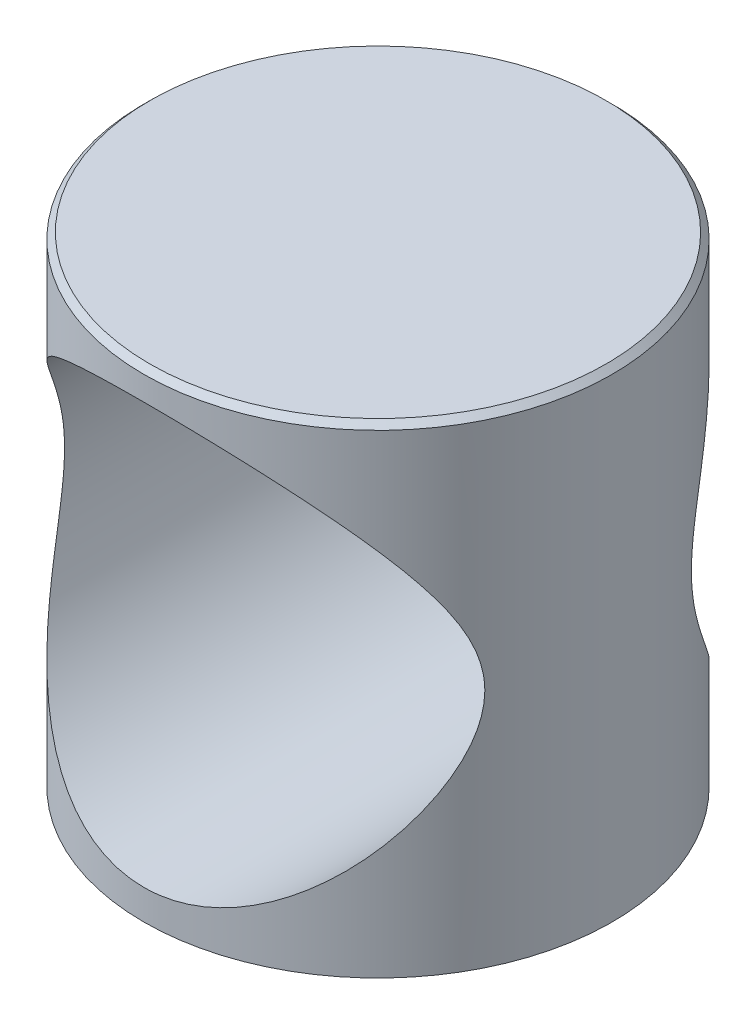
ISO-10303-21;
HEADER;
FILE_DESCRIPTION(('STEP AP214'),'2;1');
FILE_NAME('part.step','',(''),(''),'','','');
FILE_SCHEMA(('AUTOMOTIVE_DESIGN { 1 0 10303 214 1 1 1 1 }'));
ENDSEC;
DATA;
#1=APPLICATION_CONTEXT('core data for automotive mechanical design processes');
#2=APPLICATION_PROTOCOL_DEFINITION('international standard','automotive_design',2000,#1);
#3=PRODUCT_CONTEXT('',#1,'mechanical');
#4=PRODUCT('Part','Part','',(#3));
#5=PRODUCT_RELATED_PRODUCT_CATEGORY('part','',(#4));
#6=PRODUCT_DEFINITION_FORMATION('','',#4);
#7=PRODUCT_DEFINITION_CONTEXT('part definition',#1,'design');
#8=PRODUCT_DEFINITION('design','',#6,#7);
#9=PRODUCT_DEFINITION_SHAPE('','',#8);
#10=(LENGTH_UNIT() NAMED_UNIT(*) SI_UNIT(.MILLI.,.METRE.));
#11=(NAMED_UNIT(*) PLANE_ANGLE_UNIT() SI_UNIT($,.RADIAN.));
#12=(NAMED_UNIT(*) SI_UNIT($,.STERADIAN.) SOLID_ANGLE_UNIT());
#13=UNCERTAINTY_MEASURE_WITH_UNIT(LENGTH_MEASURE(1.E-05),#10,'distance_accuracy_value','');
#14=(GEOMETRIC_REPRESENTATION_CONTEXT(3) GLOBAL_UNCERTAINTY_ASSIGNED_CONTEXT((#13)) GLOBAL_UNIT_ASSIGNED_CONTEXT((#10,
#11,#12)) REPRESENTATION_CONTEXT('',''));
#15=CARTESIAN_POINT('',(0.,0.,0.));
#16=DIRECTION('',(0.,0.,1.));
#17=DIRECTION('',(1.,0.,0.));
#18=AXIS2_PLACEMENT_3D('',#15,#16,#17);
#19=CARTESIAN_POINT('',(0.,40.,0.));
#20=DIRECTION('',(0.,-1.,0.));
#21=DIRECTION('',(0.,0.,-1.));
#22=AXIS2_PLACEMENT_3D('',#19,#20,#21);
#23=CYLINDRICAL_SURFACE('',#22,39.);
#24=CARTESIAN_POINT('',(0.,39.,0.));
#25=DIRECTION('',(0.,1.,0.));
#26=DIRECTION('',(0.,0.,1.));
#27=AXIS2_PLACEMENT_3D('',#24,#25,#26);
#28=CIRCLE('',#27,39.);
#29=CARTESIAN_POINT('',(0.,39.,39.));
#30=VERTEX_POINT('',#29);
#31=EDGE_CURVE('E10',#30,#30,#28,.F.);
#32=ORIENTED_EDGE('',*,*,#31,.T.);
#33=EDGE_LOOP('',(#32));
#34=FACE_BOUND('',#33,.T.);
#35=CARTESIAN_POINT('',(0.,35.,-39.));
#36=CARTESIAN_POINT('',(-0.811855822627702,34.9999918115422,-38.9999919373142));
#37=CARTESIAN_POINT('',(-1.62385985449368,34.9716957000643,-38.974592530699));
#38=CARTESIAN_POINT('',(-3.24091649091347,34.8590564890775,-38.8735542122402));
#39=CARTESIAN_POINT('',(-4.0459673323814,34.7746995740297,-38.7979029163999));
#40=CARTESIAN_POINT('',(-5.64313223584848,34.5514956924253,-38.5979713284262));
#41=CARTESIAN_POINT('',(-6.43523298501837,34.4125959248575,-38.4736439150071));
#42=CARTESIAN_POINT('',(-7.99972552057754,34.0828927801213,-38.1790270947726));
#43=CARTESIAN_POINT('',(-8.77211804585092,33.8920913519426,-38.0087394138402));
#44=CARTESIAN_POINT('',(-10.2873102113942,33.4632218751734,-37.6268224565617));
#45=CARTESIAN_POINT('',(-11.0302705856873,33.2254717064229,-37.4154713589017));
#46=CARTESIAN_POINT('',(-12.4880904881652,32.7054519364288,-36.9544600139285));
#47=CARTESIAN_POINT('',(-13.2029503593947,32.4231828788729,-36.7048002344617));
#48=CARTESIAN_POINT('',(-14.6017974741015,31.8177386426427,-36.1710942588523));
#49=CARTESIAN_POINT('',(-15.2857826014354,31.4945606658442,-35.8870457106144));
#50=CARTESIAN_POINT('',(-16.6210722146234,30.8107570509217,-35.2884600183906));
#51=CARTESIAN_POINT('',(-17.2723693295682,30.4501230225019,-34.9739160443696));
#52=CARTESIAN_POINT('',(-18.3492608318717,29.8088936886546,-34.4173361032112));
#53=CARTESIAN_POINT('',(-18.7836206110325,29.5370146102488,-34.1820875349899));
#54=CARTESIAN_POINT('',(-19.6354113398814,28.9777526196272,-33.7000012952338));
#55=CARTESIAN_POINT('',(-20.052845808657,28.6903729595283,-33.4531660560524));
#56=CARTESIAN_POINT('',(-21.2800057732824,27.8060849642537,-32.696861389645));
#57=CARTESIAN_POINT('',(-22.0644004200768,27.1871399313285,-32.1716908498738));
#58=CARTESIAN_POINT('',(-23.566579959107,25.8959424607485,-31.0881987721606));
#59=CARTESIAN_POINT('',(-24.2842178788987,25.2235781751133,-30.5298083273148));
#60=CARTESIAN_POINT('',(-25.6517488471551,23.8314850412029,-29.3901318197539));
#61=CARTESIAN_POINT('',(-26.3016507709598,23.1117624184265,-28.8088487704076));
#62=CARTESIAN_POINT('',(-27.5491221814401,21.6106566301463,-27.6189335628395));
#63=CARTESIAN_POINT('',(-28.1451333427795,20.828232243509,-27.009979803356));
#64=CARTESIAN_POINT('',(-28.9874811964627,19.6205684526628,-26.094028746029));
#65=CARTESIAN_POINT('',(-29.2597106635775,19.2122419466898,-25.7882189551577));
#66=CARTESIAN_POINT('',(-29.7869908421857,18.3841281079306,-25.1773286364008));
#67=CARTESIAN_POINT('',(-30.0420428235123,17.9643416255461,-24.8722480562205));
#68=CARTESIAN_POINT('',(-30.5345353429542,17.1138307669632,-24.2650919012441));
#69=CARTESIAN_POINT('',(-30.7720064871651,16.6831272392765,-23.963011936597));
#70=CARTESIAN_POINT('',(-31.2297768213794,15.8096237455681,-23.3632901222155));
#71=CARTESIAN_POINT('',(-31.4500752540251,15.3668232472028,-23.0656484686888));
#72=CARTESIAN_POINT('',(-31.8731859970216,14.4688028496913,-22.4773486285006));
#73=CARTESIAN_POINT('',(-32.0760080469231,14.0135900565647,-22.1866866181088));
#74=CARTESIAN_POINT('',(-32.463952826231,13.0897944277694,-21.6150650652704));
#75=CARTESIAN_POINT('',(-32.6490780625798,12.6212134980875,-21.3341041521728));
#76=CARTESIAN_POINT('',(-33.0011172468899,11.6697695168593,-20.785390809672));
#77=CARTESIAN_POINT('',(-33.1680344837484,11.1869090647076,-20.5176359996634));
#78=CARTESIAN_POINT('',(-33.4829328797741,10.2058128170698,-19.9996263648961));
#79=CARTESIAN_POINT('',(-33.6309147235509,9.70757757826825,-19.7493709075964));
#80=CARTESIAN_POINT('',(-33.9067781228075,8.69514083896894,-19.2719059171717));
#81=CARTESIAN_POINT('',(-34.0346744024102,8.18095136832764,-19.0446795458649));
#82=CARTESIAN_POINT('',(-34.2690560600198,7.13571945061626,-18.6196325412268));
#83=CARTESIAN_POINT('',(-34.3755447950301,6.60467966105843,-18.4218072986564));
#84=CARTESIAN_POINT('',(-34.549360117726,5.61685815994064,-18.0933760914797));
#85=CARTESIAN_POINT('',(-34.6202612396673,5.16261500637664,-17.9570605341087));
#86=CARTESIAN_POINT('',(-34.7448511592343,4.24382863469701,-17.7147936641925));
#87=CARTESIAN_POINT('',(-34.7985454389879,3.77928874766968,-17.6088326817738));
#88=CARTESIAN_POINT('',(-34.8875223015405,2.84279281409537,-17.431885955132));
#89=CARTESIAN_POINT('',(-34.922843674748,2.37085457708474,-17.360826541658));
#90=CARTESIAN_POINT('',(-34.9743408375874,1.4217167485969,-17.256850987866));
#91=CARTESIAN_POINT('',(-34.9905176759039,0.944517446751654,-17.2239327582818));
#92=CARTESIAN_POINT('',(-35.0032910528363,-0.0135262709267326,-17.1979605634802));
#93=CARTESIAN_POINT('',(-34.9997938427527,-0.494377217085253,-17.2050974643639));
#94=CARTESIAN_POINT('',(-34.9731063932405,-1.45324506825497,-17.2592788184304));
#95=CARTESIAN_POINT('',(-34.949915681947,-1.93126190508333,-17.3063242278383));
#96=CARTESIAN_POINT('',(-34.8844330723082,-2.88160990745766,-17.4379376555286));
#97=CARTESIAN_POINT('',(-34.8421057248489,-3.35392884346187,-17.5225753053375));
#98=CARTESIAN_POINT('',(-34.7393696292635,-4.28925685365549,-17.7253790691132));
#99=CARTESIAN_POINT('',(-34.6789578950397,-4.75226437685799,-17.8435507200535));
#100=CARTESIAN_POINT('',(-34.5102733739219,-5.87286750467144,-18.1683180870522));
#101=CARTESIAN_POINT('',(-34.392690871744,-6.52446162274948,-18.3907903837188));
#102=CARTESIAN_POINT('',(-34.1253629822436,-7.80300489490994,-18.8822064911048));
#103=CARTESIAN_POINT('',(-33.9755988914291,-8.4299394654622,-19.1511773082712));
#104=CARTESIAN_POINT('',(-33.6460381312739,-9.66188772360003,-19.7244475462911));
#105=CARTESIAN_POINT('',(-33.4661381806845,-10.2668170064819,-20.0288673244815));
#106=CARTESIAN_POINT('',(-33.0786021705842,-11.4540837939187,-20.662624803422));
#107=CARTESIAN_POINT('',(-32.8709684080463,-12.0364231642692,-20.9919604396096));
#108=CARTESIAN_POINT('',(-32.4482720872122,-13.1310089495528,-21.6389909050624));
#109=CARTESIAN_POINT('',(-32.2353975782569,-13.6449669150132,-21.955236969134));
#110=CARTESIAN_POINT('',(-31.7880765726578,-14.6568838667932,-22.5980430191272));
#111=CARTESIAN_POINT('',(-31.5536267761682,-15.1548403899962,-22.9246045777256));
#112=CARTESIAN_POINT('',(-31.0633693379429,-16.135921788923,-23.5846611417726));
#113=CARTESIAN_POINT('',(-30.8075481228939,-16.6190369681921,-23.9181604509676));
#114=CARTESIAN_POINT('',(-30.2748471254644,-17.5707420706935,-24.5889626416945));
#115=CARTESIAN_POINT('',(-29.9979684187468,-18.039332734151,-24.9262653281929));
#116=CARTESIAN_POINT('',(-29.4231980195144,-18.962356134391,-25.6021917936565));
#117=CARTESIAN_POINT('',(-29.1253087412252,-19.416790489185,-25.9408154166285));
#118=CARTESIAN_POINT('',(-28.5084162100045,-20.3117099638527,-26.6172833717572));
#119=CARTESIAN_POINT('',(-28.1894125618882,-20.7521948224139,-26.9551276892054));
#120=CARTESIAN_POINT('',(-27.5303068016166,-21.6189377342358,-27.6279546182597));
#121=CARTESIAN_POINT('',(-27.1902142736241,-22.0452021166932,-27.9629384522399));
#122=CARTESIAN_POINT('',(-26.4886419482816,-22.8834123145281,-28.628407129201));
#123=CARTESIAN_POINT('',(-26.1271610334892,-23.2953573800009,-28.9588917360069));
#124=CARTESIAN_POINT('',(-25.1262039395511,-24.3831074762964,-29.839143190011));
#125=CARTESIAN_POINT('',(-24.4666901407416,-25.0452931010202,-30.3832163689113));
#126=CARTESIAN_POINT('',(-23.0854013486935,-26.3239447265784,-31.4455681495795));
#127=CARTESIAN_POINT('',(-22.3636232688936,-26.9404084580693,-31.963845470586));
#128=CARTESIAN_POINT('',(-20.8585874796502,-28.1217428117526,-32.9656586244524));
#129=CARTESIAN_POINT('',(-20.0754374966413,-28.6867002313532,-33.4492526001261));
#130=CARTESIAN_POINT('',(-18.8547743872211,-29.4912690843703,-34.1425914377629));
#131=CARTESIAN_POINT('',(-18.440261775696,-29.7522969325597,-34.3683472861281));
#132=CARTESIAN_POINT('',(-17.5959277386204,-30.2593106555173,-34.8081880802454));
#133=CARTESIAN_POINT('',(-17.1661025049242,-30.5052927465964,-35.0222700888176));
#134=CARTESIAN_POINT('',(-16.0508669336038,-31.1121388245887,-35.5518311240458));
#135=CARTESIAN_POINT('',(-15.3549489646418,-31.4617481391422,-35.8582927517395));
#136=CARTESIAN_POINT('',(-13.9293113602749,-32.118375305741,-36.4357740674657));
#137=CARTESIAN_POINT('',(-13.1995995793029,-32.42540298909,-36.7068019356605));
#138=CARTESIAN_POINT('',(-11.7091652483861,-32.9928928849587,-37.20905181005));
#139=CARTESIAN_POINT('',(-10.9484514747026,-33.2533681649483,-37.4402849861171));
#140=CARTESIAN_POINT('',(-9.39971061034657,-33.7238839417204,-37.8588006641102));
#141=CARTESIAN_POINT('',(-8.61168316047563,-33.9339237749449,-38.0460825877875));
#142=CARTESIAN_POINT('',(-7.00751189952843,-34.3012634812744,-38.3740769214735));
#143=CARTESIAN_POINT('',(-6.19120423044857,-34.4581651315605,-38.5144376020069));
#144=CARTESIAN_POINT('',(-4.54234628329322,-34.7140178133911,-38.743512755028));
#145=CARTESIAN_POINT('',(-3.70979596659553,-34.8129687071214,-38.8322271046943));
#146=CARTESIAN_POINT('',(-2.03612202873032,-34.9508071837052,-38.9558467019418));
#147=CARTESIAN_POINT('',(-1.1950024264219,-34.9897217253472,-38.990776101162));
#148=CARTESIAN_POINT('',(0.488302964353176,-35.0067108687729,-39.006022396628));
#149=CARTESIAN_POINT('',(1.33048864319025,-34.9847912872377,-38.9863445141728));
#150=CARTESIAN_POINT('',(2.9117445233444,-34.8866096319061,-38.898266621688));
#151=CARTESIAN_POINT('',(3.65156231850206,-34.8168689394254,-38.8357138532642));
#152=CARTESIAN_POINT('',(5.12063673012242,-34.6313025546347,-38.6694377424152));
#153=CARTESIAN_POINT('',(5.84989431732394,-34.5154811264908,-38.5657182094347));
#154=CARTESIAN_POINT('',(7.29322968200712,-34.2395789900374,-38.3189895786871));
#155=CARTESIAN_POINT('',(8.00730636451311,-34.0794951007288,-38.1759776571085));
#156=CARTESIAN_POINT('',(9.41622012960494,-33.7174128266864,-37.8531004940758));
#157=CARTESIAN_POINT('',(10.111056153705,-33.515412141157,-37.6732332296539));
#158=CARTESIAN_POINT('',(11.4980691646251,-33.0657123916972,-37.2737222464177));
#159=CARTESIAN_POINT('',(12.1895785136498,-32.8168530932247,-37.0530720786601));
#160=CARTESIAN_POINT('',(13.5458544194426,-32.2806698377246,-36.5790370296988));
#161=CARTESIAN_POINT('',(14.2106212592703,-31.9933462879664,-36.3256524950961));
#162=CARTESIAN_POINT('',(15.5115046970484,-31.3832679216747,-35.7895000643766));
#163=CARTESIAN_POINT('',(16.1476161050616,-31.0605067229366,-35.506726875951));
#164=CARTESIAN_POINT('',(17.3898376836475,-30.3824684117689,-34.9151389996298));
#165=CARTESIAN_POINT('',(17.9959415041096,-30.0271844619125,-34.6063188368213));
#166=CARTESIAN_POINT('',(19.0300949777307,-29.3790668245212,-34.0457062625528));
#167=CARTESIAN_POINT('',(19.4649138301822,-29.0926991837605,-33.7988511277337));
#168=CARTESIAN_POINT('',(20.3167993685646,-28.504308507421,-33.2937363537802));
#169=CARTESIAN_POINT('',(20.7338690406714,-28.2022881244215,-33.0354786480649));
#170=CARTESIAN_POINT('',(21.9587893022216,-27.2738297122082,-32.2452449488977));
#171=CARTESIAN_POINT('',(22.7401235055762,-26.6251379955563,-31.6979330394112));
#172=CARTESIAN_POINT('',(24.2337232940671,-25.2733950033949,-30.5713027511939));
#173=CARTESIAN_POINT('',(24.9457936983228,-24.5701996064606,-29.991900757272));
#174=CARTESIAN_POINT('',(26.2994803272701,-23.1154574622855,-28.8121968068814));
#175=CARTESIAN_POINT('',(26.9411083837735,-22.3639188687182,-28.2118983826483));
#176=CARTESIAN_POINT('',(27.8583990428192,-21.193459455456,-27.296559553334));
#177=CARTESIAN_POINT('',(28.1597468060631,-20.7913589692603,-26.9853932470806));
#178=CARTESIAN_POINT('',(28.7444087508114,-19.97525826049,-26.361744261638));
#179=CARTESIAN_POINT('',(29.0277241922569,-19.5612588722473,-26.0492616760492));
#180=CARTESIAN_POINT('',(29.5765273971003,-18.7211351977293,-25.4244373927174));
#181=CARTESIAN_POINT('',(29.842006812074,-18.2950053646494,-25.1120958279893));
#182=CARTESIAN_POINT('',(30.3549993542322,-17.4306219722832,-24.4895215713029));
#183=CARTESIAN_POINT('',(30.6025139764775,-16.9923694260719,-24.1792887058071));
#184=CARTESIAN_POINT('',(31.0789727925413,-16.1043704638258,-23.5637127802779));
#185=CARTESIAN_POINT('',(31.3079597920182,-15.6546538934946,-23.2583598378163));
#186=CARTESIAN_POINT('',(31.7478646217434,-14.7421059257066,-22.6541984388205));
#187=CARTESIAN_POINT('',(31.9587813073291,-14.2792736999073,-22.3553903977635));
#188=CARTESIAN_POINT('',(32.3620590420545,-13.3400944478729,-21.7675004510888));
#189=CARTESIAN_POINT('',(32.5544343605526,-12.863758185638,-21.4784111793511));
#190=CARTESIAN_POINT('',(32.9202725462767,-11.896345923363,-20.9133658008348));
#191=CARTESIAN_POINT('',(33.09373922412,-11.4052729187211,-20.6374070542302));
#192=CARTESIAN_POINT('',(33.4096103989189,-10.4420572523686,-20.1217019233432));
#193=CARTESIAN_POINT('',(33.5533378841599,-9.97098566880902,-19.8807723930424));
#194=CARTESIAN_POINT('',(33.8229280154583,-9.01423999312671,-19.4185761188558));
#195=CARTESIAN_POINT('',(33.948791333545,-8.52856645114615,-19.1973086354236));
#196=CARTESIAN_POINT('',(34.1813378545745,-7.54269664030618,-18.7801254126058));
#197=CARTESIAN_POINT('',(34.2880472546344,-7.04252131098653,-18.5841751509031));
#198=CARTESIAN_POINT('',(34.4810290764366,-6.0270670770812,-18.2236248456145));
#199=CARTESIAN_POINT('',(34.5673049226769,-5.51179071959466,-18.059019549774));
#200=CARTESIAN_POINT('',(34.7059622914445,-4.54908797860988,-17.7908770798803));
#201=CARTESIAN_POINT('',(34.7615356412251,-4.10366953147628,-17.6818136683206));
#202=CARTESIAN_POINT('',(34.8559217833224,-3.20451914758678,-17.495019926684));
#203=CARTESIAN_POINT('',(34.8947365956699,-2.75078821967253,-17.4172858203291));
#204=CARTESIAN_POINT('',(34.9546798467701,-1.83822293153074,-17.2966742316435));
#205=CARTESIAN_POINT('',(34.9758359249935,-1.37939769003012,-17.2537422799878));
#206=CARTESIAN_POINT('',(35.0000117087532,-0.459283342608454,-17.2046492660175));
#207=CARTESIAN_POINT('',(35.0030316949949,0.00200572506756303,-17.1984876345821));
#208=CARTESIAN_POINT('',(34.9908472581635,0.923688199494776,-17.2232628884295));
#209=CARTESIAN_POINT('',(34.9756286784726,1.38408063231663,-17.2542285916384));
#210=CARTESIAN_POINT('',(34.9273531631078,2.30009222772899,-17.3517409781548));
#211=CARTESIAN_POINT('',(34.8942956068928,2.75571122371011,-17.4182888992138));
#212=CARTESIAN_POINT('',(34.8110601188764,3.66015847705001,-17.5840450647436));
#213=CARTESIAN_POINT('',(34.760851479987,4.10897303610426,-17.6833118774493));
#214=CARTESIAN_POINT('',(34.6443317857143,4.99709833897259,-17.9105153384675));
#215=CARTESIAN_POINT('',(34.5780185508839,5.43640778768182,-18.0384558670346));
#216=CARTESIAN_POINT('',(34.3848819362435,6.57157678287377,-18.4050300517253));
#217=CARTESIAN_POINT('',(34.2459275754977,7.25903748333083,-18.6633464939849));
#218=CARTESIAN_POINT('',(33.9325404794246,8.60590798491132,-19.2272393237935));
#219=CARTESIAN_POINT('',(33.7580823849745,9.26529732624504,-19.5328494540409));
#220=CARTESIAN_POINT('',(33.3758705364356,10.5597466958017,-20.1790173799433));
#221=CARTESIAN_POINT('',(33.1679968701601,11.1947084932629,-20.5196993856117));
#222=CARTESIAN_POINT('',(32.7213501139776,12.4398838242019,-21.224688908332));
#223=CARTESIAN_POINT('',(32.4825810444468,13.0501005641738,-21.5889933483572));
#224=CARTESIAN_POINT('',(32.005541350179,14.1765063661119,-22.289075321228));
#225=CARTESIAN_POINT('',(31.7706077202409,14.6952296872366,-22.6230730357972));
#226=CARTESIAN_POINT('',(31.2780613350867,15.716368928736,-23.2993107264332));
#227=CARTESIAN_POINT('',(31.0204455778847,16.2187826784542,-23.641551789142));
#228=CARTESIAN_POINT('',(30.4826257885696,17.2083352435482,-24.3310676162124));
#229=CARTESIAN_POINT('',(30.2024082675122,17.6954646926244,-24.6783452835475));
#230=CARTESIAN_POINT('',(29.6195930530274,18.6546131340945,-25.3749079374633));
#231=CARTESIAN_POINT('',(29.3169963779406,19.1266328126443,-25.7241928320409));
#232=CARTESIAN_POINT('',(28.6895871041451,20.0554584149151,-26.4221039962328));
#233=CARTESIAN_POINT('',(28.3647918701715,20.5122758238567,-26.7707305663139));
#234=CARTESIAN_POINT('',(27.6926777064204,21.4109886562531,-27.4654207045732));
#235=CARTESIAN_POINT('',(27.3453582633293,21.8528837392874,-27.8114842141404));
#236=CARTESIAN_POINT('',(26.2696251405085,23.1554550402622,-28.8425457132267));
#237=CARTESIAN_POINT('',(25.5069990625673,23.9936664519738,-29.5209077014081));
#238=CARTESIAN_POINT('',(24.0636381025768,25.4311493491914,-30.7020289438681));
#239=CARTESIAN_POINT('',(23.4005824633271,26.0430300658643,-31.2111697093146));
#240=CARTESIAN_POINT('',(22.0169973787939,27.2227510819018,-32.2021052517532));
#241=CARTESIAN_POINT('',(21.2964674399709,27.7905910029996,-32.6838997938589));
#242=CARTESIAN_POINT('',(19.7990877243865,28.8764659815905,-33.6120680081586));
#243=CARTESIAN_POINT('',(19.022314747824,29.3945667893457,-34.0584883013739));
#244=CARTESIAN_POINT('',(17.4127260981661,30.3757251526298,-34.9088068378204));
#245=CARTESIAN_POINT('',(16.5799245706356,30.8387965204102,-35.3127157483799));
#246=CARTESIAN_POINT('',(15.0371364534503,31.6143881864377,-35.9922519415898));
#247=CARTESIAN_POINT('',(14.3369701406526,31.9383110855726,-36.2772028814535));
#248=CARTESIAN_POINT('',(12.9049416891761,32.5433005558645,-36.8109510142269));
#249=CARTESIAN_POINT('',(12.1730809843022,32.8243690630926,-37.0597498403889));
#250=CARTESIAN_POINT('',(10.6818268755027,33.3394668881431,-37.5167423521211));
#251=CARTESIAN_POINT('',(9.92247218666717,33.5735595292469,-37.7249906882018));
#252=CARTESIAN_POINT('',(8.37954723206446,33.9914912398427,-38.0974076215294));
#253=CARTESIAN_POINT('',(7.59598310492872,34.1753429340817,-38.2615872923432));
#254=CARTESIAN_POINT('',(6.24889933710825,34.4422804613707,-38.5002376118875));
#255=CARTESIAN_POINT('',(5.69017721973622,34.5390381227024,-38.586834408192));
#256=CARTESIAN_POINT('',(4.56543245028081,34.7056184962114,-38.7360113120018));
#257=CARTESIAN_POINT('',(3.99940882447146,34.7754375766801,-38.7985881812693));
#258=CARTESIAN_POINT('',(2.86235226121478,34.8874380086556,-38.8990066001466));
#259=CARTESIAN_POINT('',(2.29131855259983,34.9296150270025,-38.9368442716464));
#260=CARTESIAN_POINT('',(1.14688095797309,34.9858967289215,-38.9873418587826));
#261=CARTESIAN_POINT('',(0.573477455006154,35.0000057841501,-39.0000056953075));
#262=CARTESIAN_POINT('',(0.,35.,-39.));
#263=B_SPLINE_CURVE_WITH_KNOTS('',3,(#35,#36,#37,#38,#39,#40,#41,#42,#43,#44,#45,#46,#47,#48,
#49,#50,#51,#52,#53,#54,#55,#56,#57,#58,#59,#60,#61,#62,#63,#64,#65,#66,#67,#68,#69,#70,#71,#72,
#73,#74,#75,#76,#77,#78,#79,#80,#81,#82,#83,#84,#85,#86,#87,#88,#89,#90,#91,#92,#93,#94,#95,#96,
#97,#98,#99,#100,#101,#102,#103,#104,#105,#106,#107,#108,#109,#110,#111,#112,#113,#114,#115,
#116,#117,#118,#119,#120,#121,#122,#123,#124,#125,#126,#127,#128,#129,#130,#131,#132,#133,#134,
#135,#136,#137,#138,#139,#140,#141,#142,#143,#144,#145,#146,#147,#148,#149,#150,#151,#152,#153,
#154,#155,#156,#157,#158,#159,#160,#161,#162,#163,#164,#165,#166,#167,#168,#169,#170,#171,#172,
#173,#174,#175,#176,#177,#178,#179,#180,#181,#182,#183,#184,#185,#186,#187,#188,#189,#190,#191,
#192,#193,#194,#195,#196,#197,#198,#199,#200,#201,#202,#203,#204,#205,#206,#207,#208,#209,#210,
#211,#212,#213,#214,#215,#216,#217,#218,#219,#220,#221,#222,#223,#224,#225,#226,#227,#228,#229,
#230,#231,#232,#233,#234,#235,#236,#237,#238,#239,#240,#241,#242,#243,#244,#245,#246,#247,#248,
#249,#250,#251,#252,#253,#254,#255,#256,#257,#258,#259,#260,#261,#262),.UNSPECIFIED.,.T.,.F.,(4,
2,2,2,2,2,2,2,2,2,2,2,2,2,2,2,2,2,2,2,2,2,2,2,2,2,2,2,2,2,2,2,2,2,2,2,2,2,2,2,2,2,2,2,2,2,2,2,2,
2,2,2,2,2,2,2,2,2,2,2,2,2,2,2,2,2,2,2,2,2,2,2,2,2,2,2,2,2,2,2,2,2,2,2,2,2,2,2,2,2,2,2,2,2,2,2,2,
2,2,2,2,2,2,2,2,2,2,2,2,2,2,2,2,4),(0.,2.43494381685657,4.87048792018034,7.30839562353584,
9.74621179221688,12.1680554831567,14.5898695995781,17.0118494549689,19.4343730178278,
21.1253532725692,22.8159801189489,26.197949413314,29.5871964948619,32.9759989289725,
36.4431917889155,38.1776096940303,39.9118992425047,41.643094919802,43.3743669038299,
45.1046677277576,46.8347230717416,48.5644653978762,50.2941451674615,52.0225509817215,
53.7506855459083,55.1880652413719,56.6249865289733,58.0588616276332,59.4926581789534,
60.9332926756468,62.3739616915397,63.8173104379102,65.2608976419087,67.3528431180982,
69.4460077082566,71.5464985069316,73.6468154462626,75.5658482211962,77.4851749931499,
79.4057301636666,81.326187293809,83.2464241116668,85.1666968795997,87.0861032570346,
89.0056100031013,92.2467714555204,95.4880936710337,98.7238486082721,100.341493528218,
101.959543593082,104.467834241296,106.975544804503,109.48255033261,111.989588842516,
114.515019830342,117.040456823936,119.564759462159,122.088820746406,124.323375540111,
126.557723603234,128.792232283439,131.026863647362,133.326619452862,135.626350909876,
137.926497222474,140.227128222259,141.955139275093,143.682858443387,147.139183406243,
150.604981852885,154.070197275028,155.842976226577,157.615631175531,159.3891101439,
161.162441350682,162.931551003394,164.700772637486,166.468621627993,168.236113686486,
169.88023876132,171.524301969664,173.166099142264,174.807620967954,176.192136090817,
177.576484281194,178.958661603339,180.340817532475,181.72404697434,183.107324535903,
184.493091795179,185.87904669599,188.117458298355,190.357474369968,192.605715979652,
194.853665322425,196.833506731813,198.813610568799,200.794905020769,202.776109371354,
204.755781288846,206.735498337772,210.692165120241,213.797610691871,216.903082933246,
220.004391824903,223.104920644273,225.569857294718,228.034682551513,230.496162578395,
232.957023504725,234.676781964053,236.396772190643,238.117031977837,239.837023809212),.UNSPECIFIED.);
#264=CARTESIAN_POINT('',(0.,35.,-39.));
#265=VERTEX_POINT('',#264);
#266=EDGE_CURVE('E45',#265,#265,#263,.T.);
#267=ORIENTED_EDGE('',*,*,#266,.T.);
#268=EDGE_LOOP('',(#267));
#269=FACE_BOUND('',#268,.T.);
#270=CARTESIAN_POINT('',(35.,0.,17.2046505340852));
#271=CARTESIAN_POINT('',(34.9999993875609,-0.528877933146693,17.2046524935468));
#272=CARTESIAN_POINT('',(34.9879749074431,-1.05776417674476,17.2291786521058));
#273=CARTESIAN_POINT('',(34.9403082102732,-2.11007739713146,17.3256360658182));
#274=CARTESIAN_POINT('',(34.9046636037118,-2.6335038161395,17.3975721171474));
#275=CARTESIAN_POINT('',(34.8107458380347,-3.67218332011431,17.5847332044498));
#276=CARTESIAN_POINT('',(34.7523971993949,-4.18740311170372,17.7001025924985));
#277=CARTESIAN_POINT('',(34.6146058172733,-5.20508817417572,17.9680749962519));
#278=CARTESIAN_POINT('',(34.5351592917099,-5.70755114051353,18.1206846873864));
#279=CARTESIAN_POINT('',(34.3141491074193,-6.93485740284216,18.5369303421645));
#280=CARTESIAN_POINT('',(34.1610334563194,-7.65142320176074,18.8187989378343));
#281=CARTESIAN_POINT('',(33.816434275981,-9.05378202260727,19.4312191107798));
#282=CARTESIAN_POINT('',(33.6249261763159,-9.73955499194263,19.7618018280723));
#283=CARTESIAN_POINT('',(33.2059474894719,-11.084333429746,20.4580232233962));
#284=CARTESIAN_POINT('',(32.9783676385626,-11.7432496671721,20.8237670377075));
#285=CARTESIAN_POINT('',(32.4896326168766,-13.0345820089833,21.5783666656553));
#286=CARTESIAN_POINT('',(32.2284814986719,-13.6670012997623,21.9672196866113));
#287=CARTESIAN_POINT('',(31.7156847912712,-14.8137682370219,22.6998697854744));
#288=CARTESIAN_POINT('',(31.4685812759643,-15.3315007940847,23.0415801625912));
#289=CARTESIAN_POINT('',(30.9512925155992,-16.3506606831632,23.7319097209714));
#290=CARTESIAN_POINT('',(30.6811045531151,-16.8520860859352,24.080529711892));
#291=CARTESIAN_POINT('',(30.1176712681643,-17.8395391094715,24.781611652811));
#292=CARTESIAN_POINT('',(29.8244131907327,-18.3255580010208,25.1340756339904));
#293=CARTESIAN_POINT('',(29.2149886247656,-19.2822740725062,25.8399278704337));
#294=CARTESIAN_POINT('',(28.8988230825912,-19.752971884229,26.1933160869344));
#295=CARTESIAN_POINT('',(28.2438128290495,-20.6786885010047,26.8982949395969));
#296=CARTESIAN_POINT('',(27.904992745144,-21.1337235429219,27.2498870945207));
#297=CARTESIAN_POINT('',(27.2042473041135,-22.0284318851108,27.9494938911652));
#298=CARTESIAN_POINT('',(26.8423213814222,-22.468104808953,28.2975084450739));
#299=CARTESIAN_POINT('',(25.7218777423921,-23.7631681160854,29.3328860484784));
#300=CARTESIAN_POINT('',(24.9282204637857,-24.5952742656941,30.0120994132683));
#301=CARTESIAN_POINT('',(23.4494545229644,-25.9979963628082,31.1734116277029));
#302=CARTESIAN_POINT('',(22.784388201648,-26.5832477505841,31.6635151719153));
#303=CARTESIAN_POINT('',(21.3993241964858,-27.7103942227242,32.6155604183303));
#304=CARTESIAN_POINT('',(20.6793275210362,-28.2522901026229,33.0775026372306));
#305=CARTESIAN_POINT('',(19.1858067186808,-29.2870101512693,33.9655512404938));
#306=CARTESIAN_POINT('',(18.4123594695554,-29.7799024103802,34.391707217995));
#307=CARTESIAN_POINT('',(16.8123813253692,-30.7115650552614,35.2015225974138));
#308=CARTESIAN_POINT('',(15.9858618234856,-31.1503469983762,35.5851910723841));
#309=CARTESIAN_POINT('',(14.4486773171165,-31.8875200607329,36.2324334971672));
#310=CARTESIAN_POINT('',(13.7468430717784,-32.1966036026948,36.5048377462062));
#311=CARTESIAN_POINT('',(12.3129285461157,-32.7717602621176,37.0131077043672));
#312=CARTESIAN_POINT('',(11.5808515830106,-33.0378380810834,37.2489774074295));
#313=CARTESIAN_POINT('',(10.0899893555443,-33.5232215062743,37.6801534641544));
#314=CARTESIAN_POINT('',(9.33121443649715,-33.7425450019929,37.8754753317856));
#315=CARTESIAN_POINT('',(7.79100418844419,-34.1310848505449,38.2220254771073));
#316=CARTESIAN_POINT('',(7.00956861300221,-34.3003006582292,38.373253275074));
#317=CARTESIAN_POINT('',(5.42465025118383,-34.5864921502992,38.6292806002787));
#318=CARTESIAN_POINT('',(4.62106302489878,-34.7031470653417,38.7337950142287));
#319=CARTESIAN_POINT('',(3.00278184149533,-34.8804500639643,38.8927274471934));
#320=CARTESIAN_POINT('',(2.18808785728505,-34.941098010906,38.9471453439891));
#321=CARTESIAN_POINT('',(0.554838930484289,-35.0051410070887,39.0046112288471));
#322=CARTESIAN_POINT('',(-0.26371500454064,-35.0085502505257,39.0076719525886));
#323=CARTESIAN_POINT('',(-1.89758362952713,-34.9580759953294,38.9623786324136));
#324=CARTESIAN_POINT('',(-2.71289853086159,-34.904196299016,38.9140280007161));
#325=CARTESIAN_POINT('',(-4.25535202988207,-34.7481514304589,38.7741276413919));
#326=CARTESIAN_POINT('',(-4.98343936830452,-34.6511201415158,38.6871723471516));
#327=CARTESIAN_POINT('',(-6.42637427539174,-34.4127354750406,38.4738032339344));
#328=CARTESIAN_POINT('',(-7.14122287232519,-34.2713855552092,38.3473924932405));
#329=CARTESIAN_POINT('',(-8.55357623385118,-33.9464514163076,38.0572754342921));
#330=CARTESIAN_POINT('',(-9.25107885872124,-33.7628620151166,37.8935645399188));
#331=CARTESIAN_POINT('',(-10.6251568950034,-33.3559524281815,37.5314661347476));
#332=CARTESIAN_POINT('',(-11.3017310355845,-33.1326298352741,37.3330765230154));
#333=CARTESIAN_POINT('',(-12.6686590177002,-32.6353106698468,36.8924039903687));
#334=CARTESIAN_POINT('',(-13.3576334968715,-32.3591646818734,36.6482750507307));
#335=CARTESIAN_POINT('',(-14.7065456505687,-31.7688467389004,36.1281074423729));
#336=CARTESIAN_POINT('',(-15.3664830713968,-31.4546744517536,35.8520684949307));
#337=CARTESIAN_POINT('',(-16.6556342177781,-30.7914820908484,35.271654722611));
#338=CARTESIAN_POINT('',(-17.2848462984333,-30.4424601544335,34.9672783832054));
#339=CARTESIAN_POINT('',(-18.511565286891,-29.7124807702331,34.3336373224519));
#340=CARTESIAN_POINT('',(-19.1090654696499,-29.3315165923959,34.0043673576003));
#341=CARTESIAN_POINT('',(-20.1336719244537,-28.634295400195,33.4050760281308));
#342=CARTESIAN_POINT('',(-20.5675758953528,-28.3241264907573,33.1395286736288));
#343=CARTESIAN_POINT('',(-21.4163197708744,-27.6879481422667,32.597466273492));
#344=CARTESIAN_POINT('',(-21.8311627556888,-27.3619412802159,32.3209530134619));
#345=CARTESIAN_POINT('',(-23.0475634085372,-26.3612006579157,31.4767223449933));
#346=CARTESIAN_POINT('',(-23.8207417738796,-25.6639187265861,30.8944624147947));
#347=CARTESIAN_POINT('',(-25.2942449959014,-24.2131109938162,29.7002410704352));
#348=CARTESIAN_POINT('',(-25.9942857293555,-23.4593840511243,29.088176447716));
#349=CARTESIAN_POINT('',(-27.3194549799248,-21.9018885458799,27.8472699110302));
#350=CARTESIAN_POINT('',(-27.9446005147591,-21.0981314145206,27.2184318481871));
#351=CARTESIAN_POINT('',(-28.8339518584613,-19.8462451490942,26.264019453964));
#352=CARTESIAN_POINT('',(-29.1254551743386,-19.4159217014131,25.9401645943422));
#353=CARTESIAN_POINT('',(-29.6892148910751,-18.5424052519586,25.2929749258611));
#354=CARTESIAN_POINT('',(-29.9614710523067,-18.0992120900537,24.9696401235255));
#355=CARTESIAN_POINT('',(-30.4869055369183,-17.1994248223312,24.3253268388744));
#356=CARTESIAN_POINT('',(-30.7400705030649,-16.7428216388609,24.0043501455686));
#357=CARTESIAN_POINT('',(-31.2270288116674,-15.8160266595796,23.367356626796));
#358=CARTESIAN_POINT('',(-31.4608226172629,-15.34583518901,23.0513396828945));
#359=CARTESIAN_POINT('',(-31.9079194853118,-14.3930707882607,22.4283538839754));
#360=CARTESIAN_POINT('',(-32.1213015043136,-13.9105555446133,22.12135363613));
#361=CARTESIAN_POINT('',(-32.5282650725807,-12.9303375372984,21.518462374471));
#362=CARTESIAN_POINT('',(-32.7218443945868,-12.4326330734166,21.2225726126452));
#363=CARTESIAN_POINT('',(-33.0882880113757,-11.4216427106445,20.6465863588354));
#364=CARTESIAN_POINT('',(-33.2611797671339,-10.9083786267968,20.3664691977146));
#365=CARTESIAN_POINT('',(-33.5855423326602,-9.86457842288389,19.8270096845045));
#366=CARTESIAN_POINT('',(-33.7370207589037,-9.33404852708953,19.567659959979));
#367=CARTESIAN_POINT('',(-33.9955367325531,-8.33819369514524,19.1144101377588));
#368=CARTESIAN_POINT('',(-34.1058234633499,-7.87550337131427,18.9165955326947));
#369=CARTESIAN_POINT('',(-34.3090872286473,-6.93665363044027,18.5453851302974));
#370=CARTESIAN_POINT('',(-34.4020657226318,-6.46049535296047,18.3719872743694));
#371=CARTESIAN_POINT('',(-34.5692009151043,-5.49627597103791,18.0555349907233));
#372=CARTESIAN_POINT('',(-34.6434065023548,-5.00824948858999,17.9124019100985));
#373=CARTESIAN_POINT('',(-34.7718843566465,-4.02044892072259,17.6617093924771));
#374=CARTESIAN_POINT('',(-34.8261570969105,-3.52067511449443,17.5541491109575));
#375=CARTESIAN_POINT('',(-34.9140426297377,-2.50465418395991,17.3787085959455));
#376=CARTESIAN_POINT('',(-34.9473397526295,-1.98827287881218,17.3114353651034));
#377=CARTESIAN_POINT('',(-34.9909404748282,-0.95059745705059,17.2231409144274));
#378=CARTESIAN_POINT('',(-35.0012469987096,-0.429303973775264,17.2021138117483));
#379=CARTESIAN_POINT('',(-34.9985117740202,0.613074938338203,17.2076779888299));
#380=CARTESIAN_POINT('',(-34.9854651599273,1.13416030119058,17.2342791917359));
#381=CARTESIAN_POINT('',(-34.9364693789329,2.17084656706464,17.3333801202661));
#382=CARTESIAN_POINT('',(-34.9005163334824,2.6864465262557,17.4058876187955));
#383=CARTESIAN_POINT('',(-34.8014557003185,3.76634664191752,17.6031858205031));
#384=CARTESIAN_POINT('',(-34.7357137266223,4.32947597482797,17.7330058427893));
#385=CARTESIAN_POINT('',(-34.5791786407494,5.44015535141164,18.0363343247722));
#386=CARTESIAN_POINT('',(-34.4883796506914,5.98770170633948,18.2098530344823));
#387=CARTESIAN_POINT('',(-34.2834118892683,7.06759195853518,18.5928736106104));
#388=CARTESIAN_POINT('',(-34.1691626748305,7.59987613969852,18.8024989271463));
#389=CARTESIAN_POINT('',(-33.9192361036764,8.64727597340429,19.2497014268241));
#390=CARTESIAN_POINT('',(-33.7835578196108,9.16239088177248,19.4872798195301));
#391=CARTESIAN_POINT('',(-33.5037746486384,10.1357091425563,19.9641511944432));
#392=CARTESIAN_POINT('',(-33.3612071730457,10.595172953851,20.20179317399));
#393=CARTESIAN_POINT('',(-33.0598378445908,11.5010886933826,20.6912964476161));
#394=CARTESIAN_POINT('',(-32.9010329737096,11.9475381827786,20.9431603811981));
#395=CARTESIAN_POINT('',(-32.5676643297043,12.8284516761658,21.4578970757329));
#396=CARTESIAN_POINT('',(-32.3930897798493,13.2629072148929,21.7207772982476));
#397=CARTESIAN_POINT('',(-32.0286760170439,14.1202279528465,22.2546259587473));
#398=CARTESIAN_POINT('',(-31.8388376822671,14.5430938169892,22.5255939308555));
#399=CARTESIAN_POINT('',(-31.4438600367379,15.378473151296,23.0737500294671));
#400=CARTESIAN_POINT('',(-31.2386995328307,15.7909711868589,23.3509463862714));
#401=CARTESIAN_POINT('',(-30.8134543000912,16.6054823951143,23.9092927658588));
#402=CARTESIAN_POINT('',(-30.5933684302558,17.0074947629462,24.1904430896065));
#403=CARTESIAN_POINT('',(-29.9110184607827,18.1980258520946,25.0370883005499));
#404=CARTESIAN_POINT('',(-29.4264674937784,18.9714487861765,25.6060505164113));
#405=CARTESIAN_POINT('',(-28.3459147667688,20.5552551780851,26.7996546040664));
#406=CARTESIAN_POINT('',(-27.743598074898,21.3614704353158,27.4241104099312));
#407=CARTESIAN_POINT('',(-26.4658368438154,22.9255159812069,28.6591951822614));
#408=CARTESIAN_POINT('',(-25.7903780429069,23.6833367876605,29.2698214239863));
#409=CARTESIAN_POINT('',(-24.3664373942551,25.1458949326763,30.4653764824561));
#410=CARTESIAN_POINT('',(-23.618092496416,25.8507275793883,31.0503506084896));
#411=CARTESIAN_POINT('',(-22.4398888677534,26.8648415813208,31.9011933465189));
#412=CARTESIAN_POINT('',(-22.0379148917159,27.1956604780903,32.1803454446292));
#413=CARTESIAN_POINT('',(-21.2151852855087,27.8422294259367,32.7285855669322));
#414=CARTESIAN_POINT('',(-20.7944251727784,28.1579758429776,32.9976711607007));
#415=CARTESIAN_POINT('',(-19.707078307799,28.9358605413165,33.6634048602414));
#416=CARTESIAN_POINT('',(-19.0280038222648,29.3872615684157,34.0523832619915));
#417=CARTESIAN_POINT('',(-17.6272146030011,30.2482560553436,34.7981429686082));
#418=CARTESIAN_POINT('',(-16.905510079093,30.6578594620476,35.1549319314702));
#419=CARTESIAN_POINT('',(-15.4208610627279,31.4308329772744,35.8310225160366));
#420=CARTESIAN_POINT('',(-14.6579193087938,31.7942061505386,36.1503266226165));
#421=CARTESIAN_POINT('',(-13.0934118922715,32.4698087922505,36.7459257952308));
#422=CARTESIAN_POINT('',(-12.2918456714815,32.7820375212701,37.0222202394441));
#423=CARTESIAN_POINT('',(-10.6457788527752,33.3531683465334,37.5288726652617));
#424=CARTESIAN_POINT('',(-9.80092435001543,33.6114954423645,37.75873457217));
#425=CARTESIAN_POINT('',(-8.08167711826462,34.0657722678929,38.1636769064303));
#426=CARTESIAN_POINT('',(-7.20728415557311,34.2617215039452,38.3387569002499));
#427=CARTESIAN_POINT('',(-5.43732936012139,34.5867625029559,38.6295076641299));
#428=CARTESIAN_POINT('',(-4.54179023980975,34.7159228658798,38.7452393907669));
#429=CARTESIAN_POINT('',(-2.73761780565324,34.9045498319323,38.9143396621447));
#430=CARTESIAN_POINT('',(-1.82898688904657,34.9640290342424,38.9677194808461));
#431=CARTESIAN_POINT('',(-0.146610688987098,35.0082220463628,39.0073784832002));
#432=CARTESIAN_POINT('',(0.626689813372688,35.0029076515622,39.0026072189389));
#433=CARTESIAN_POINT('',(2.1695387904041,34.9412208056857,38.9472555496812));
#434=CARTESIAN_POINT('',(2.93908770666306,34.8848545171571,38.8966806737045));
#435=CARTESIAN_POINT('',(4.4685450784506,34.7220918073753,38.7507724505505));
#436=CARTESIAN_POINT('',(5.22845349626069,34.6156951904402,38.6554389283101));
#437=CARTESIAN_POINT('',(6.73323974336594,34.3547179940881,38.421911148382));
#438=CARTESIAN_POINT('',(7.47811711396735,34.2001359465846,38.2837155847984));
#439=CARTESIAN_POINT('',(8.92216996265057,33.851545033608,37.9726367774878));
#440=CARTESIAN_POINT('',(9.62203092295493,33.6591176923733,37.8011476830318));
#441=CARTESIAN_POINT('',(10.9998284968928,33.2343716325726,37.423442140154));
#442=CARTESIAN_POINT('',(11.6777664168684,33.0020552961217,37.2172277654917));
#443=CARTESIAN_POINT('',(13.0090246265598,32.5003289962594,36.773057731909));
#444=CARTESIAN_POINT('',(13.6623438622517,32.2309174469472,36.5351007159355));
#445=CARTESIAN_POINT('',(14.9424491293939,31.6577812245063,36.0304959392894));
#446=CARTESIAN_POINT('',(15.5692296852306,31.3540495172139,35.7638422975716));
#447=CARTESIAN_POINT('',(16.6211430636591,30.805568484411,35.2841427501489));
#448=CARTESIAN_POINT('',(17.0531330605545,30.5684607569205,35.0772888101248));
#449=CARTESIAN_POINT('',(17.9022203239429,30.0790723319612,34.6516382557596));
#450=CARTESIAN_POINT('',(18.3193203748388,29.8267944952231,34.43284389382));
#451=CARTESIAN_POINT('',(19.5483384032604,29.0482902097785,33.7599589753622));
#452=CARTESIAN_POINT('',(20.337804336134,28.500482172509,33.2894448219271));
#453=CARTESIAN_POINT('',(21.8573486081602,27.3526204885759,32.312148726294));
#454=CARTESIAN_POINT('',(22.5872671000907,26.7524346266221,31.8052756138233));
#455=CARTESIAN_POINT('',(23.9857541157017,25.5060928578287,30.7643152022107));
#456=CARTESIAN_POINT('',(24.6543260636963,24.859939520435,30.2302294246489));
#457=CARTESIAN_POINT('',(25.6909361135461,23.7762081356857,29.3470609424165));
#458=CARTESIAN_POINT('',(26.0775444468683,23.3514335187984,29.0038280504237));
#459=CARTESIAN_POINT('',(26.8273131347475,22.4860625326984,28.3117548592757));
#460=CARTESIAN_POINT('',(27.190474567841,22.0454668926917,27.9629148189674));
#461=CARTESIAN_POINT('',(27.8937365424364,21.1486262971055,27.2614429093737));
#462=CARTESIAN_POINT('',(28.2338240678863,20.6923727237882,26.9088090277902));
#463=CARTESIAN_POINT('',(28.8908800093818,19.7646190586681,26.2020955407588));
#464=CARTESIAN_POINT('',(29.207849010947,19.2931193534388,25.8480159721657));
#465=CARTESIAN_POINT('',(29.8183782966022,18.3353869991844,25.1412426051212));
#466=CARTESIAN_POINT('',(30.1119684451312,17.8491742777639,24.7885476042068));
#467=CARTESIAN_POINT('',(30.6762121613108,16.8610129669749,24.0867743749033));
#468=CARTESIAN_POINT('',(30.946864312681,16.3590634085708,23.737696371008));
#469=CARTESIAN_POINT('',(31.4648608313963,15.3391473406002,23.0466660239765));
#470=CARTESIAN_POINT('',(31.7122230182506,14.8211934858872,22.7047083915574));
#471=CARTESIAN_POINT('',(32.183474653937,13.767962133232,22.0316282833774));
#472=CARTESIAN_POINT('',(32.4073684577035,13.2326878735806,21.7005038052239));
#473=CARTESIAN_POINT('',(32.8192418807944,12.1738147051671,21.0720314408895));
#474=CARTESIAN_POINT('',(33.0085292319102,11.6512346887281,20.7738300713337));
#475=CARTESIAN_POINT('',(33.3647608891188,10.5880629286996,20.1967247033147));
#476=CARTESIAN_POINT('',(33.5317060638624,10.0474718863894,19.9178199548139));
#477=CARTESIAN_POINT('',(33.8417997517349,8.94754627267855,19.3862601696212));
#478=CARTESIAN_POINT('',(33.9849774496077,8.38823571742029,19.1335730847325));
#479=CARTESIAN_POINT('',(34.1806724816056,7.53437616982934,18.7803045295342));
#480=CARTESIAN_POINT('',(34.2427215620462,7.2472965300483,18.6668497050923));
#481=CARTESIAN_POINT('',(34.3602207086301,6.66802997824839,18.4496737286312));
#482=CARTESIAN_POINT('',(34.4156685787546,6.3758414035119,18.3459558181954));
#483=CARTESIAN_POINT('',(34.5534646616165,5.59480880671309,18.0856773312941));
#484=CARTESIAN_POINT('',(34.6298533569028,5.10166146921592,17.9386225310395));
#485=CARTESIAN_POINT('',(34.7622665960095,4.10342889245984,17.6806656222687));
#486=CARTESIAN_POINT('',(34.8182993964487,3.59834858210692,17.5697488575772));
#487=CARTESIAN_POINT('',(34.9084864572755,2.58027082168861,17.3898754821738));
#488=CARTESIAN_POINT('',(34.9427053972063,2.06730143940842,17.3207948552758));
#489=CARTESIAN_POINT('',(34.988461696796,1.03622379522975,17.2281829712941));
#490=CARTESIAN_POINT('',(35.0000005999767,0.518115885453169,17.2046486144964));
#491=CARTESIAN_POINT('',(35.,0.,17.2046505340852));
#492=B_SPLINE_CURVE_WITH_KNOTS('',3,(#270,#271,#272,#273,#274,#275,#276,#277,#278,#279,#280,
#281,#282,#283,#284,#285,#286,#287,#288,#289,#290,#291,#292,#293,#294,#295,#296,#297,#298,#299,
#300,#301,#302,#303,#304,#305,#306,#307,#308,#309,#310,#311,#312,#313,#314,#315,#316,#317,#318,
#319,#320,#321,#322,#323,#324,#325,#326,#327,#328,#329,#330,#331,#332,#333,#334,#335,#336,#337,
#338,#339,#340,#341,#342,#343,#344,#345,#346,#347,#348,#349,#350,#351,#352,#353,#354,#355,#356,
#357,#358,#359,#360,#361,#362,#363,#364,#365,#366,#367,#368,#369,#370,#371,#372,#373,#374,#375,
#376,#377,#378,#379,#380,#381,#382,#383,#384,#385,#386,#387,#388,#389,#390,#391,#392,#393,#394,
#395,#396,#397,#398,#399,#400,#401,#402,#403,#404,#405,#406,#407,#408,#409,#410,#411,#412,#413,
#414,#415,#416,#417,#418,#419,#420,#421,#422,#423,#424,#425,#426,#427,#428,#429,#430,#431,#432,
#433,#434,#435,#436,#437,#438,#439,#440,#441,#442,#443,#444,#445,#446,#447,#448,#449,#450,#451,
#452,#453,#454,#455,#456,#457,#458,#459,#460,#461,#462,#463,#464,#465,#466,#467,#468,#469,#470,
#471,#472,#473,#474,#475,#476,#477,#478,#479,#480,#481,#482,#483,#484,#485,#486,#487,#488,#489,
#490,#491),.UNSPECIFIED.,.T.,.F.,(4,2,2,2,2,2,2,2,2,2,2,2,2,2,2,2,2,2,2,2,2,2,2,2,2,2,2,2,2,2,2,
2,2,2,2,2,2,2,2,2,2,2,2,2,2,2,2,2,2,2,2,2,2,2,2,2,2,2,2,2,2,2,2,2,2,2,2,2,2,2,2,2,2,2,2,2,2,2,2,
2,2,2,2,2,2,2,2,2,2,2,2,2,2,2,2,2,2,2,2,2,2,2,2,2,2,2,2,2,2,2,4),(0.,1.58596963529723,
3.17209973830655,4.76354861202278,6.35528296728382,8.70644812403923,11.0591228124426,
13.4190651133019,15.7787227996207,17.7812940248527,19.784101311893,21.788023796538,
23.7918635415897,25.7935592833925,27.7953040398971,31.7958914820982,34.830789204497,
37.8656312264854,40.8961956153054,43.9261115849857,46.3652822551891,48.8041860878644,
51.2421550470009,53.6801505291663,56.1328295424162,58.585514539376,61.0375913044295,
63.4895053330428,65.7059552257585,67.9222322360031,70.1387812937469,72.3554646828468,
74.6973242272837,77.0392042285684,79.3812094665537,81.7237093979325,83.5105252109667,
85.2970512576277,88.8711151147127,92.4585839718265,96.0452361304837,97.8820854857897,
99.7189577058948,101.557103401604,103.395205136911,105.225881945638,107.056764429333,
108.885188958668,110.712961493143,112.257514004859,113.801936216102,115.342294022136,
116.882615256387,118.445595867432,120.008377644428,121.571485057937,123.134857209349,
124.876950044517,126.619451888159,128.368034180072,130.116692163147,131.725751227437,
133.335109910527,134.945576844738,136.555951189917,138.1685957481,139.781363727805,
143.005313581616,146.555193732857,150.105767312133,153.64979369866,155.421463859043,
157.193559040838,159.901387833021,162.608570713822,165.31557403369,168.022616486986,
170.757206575734,173.491818304901,176.223615661632,178.954919000673,181.271947489759,
183.588696324286,185.905454220312,188.222282708904,190.457459058409,192.692501972695,
194.927640469591,197.163237908027,198.766002072704,200.368464935363,203.57401014694,
206.787894960389,210.001600268135,212.008377252606,214.015061861256,216.022869192745,
218.030625655106,220.035774809104,222.041047678679,224.044773598559,226.048127034284,
227.9395381885,229.830875784379,231.719873494138,232.664228104014,233.608895998821,
235.167974501188,236.726419912873,238.280222669952,239.833919677133),.UNSPECIFIED.);
#493=CARTESIAN_POINT('',(35.,0.,17.2046505340852));
#494=VERTEX_POINT('',#493);
#495=EDGE_CURVE('E53',#494,#494,#492,.T.);
#496=ORIENTED_EDGE('',*,*,#495,.T.);
#497=EDGE_LOOP('',(#496));
#498=FACE_BOUND('',#497,.T.);
#499=CARTESIAN_POINT('',(0.,-40.,0.));
#500=DIRECTION('',(0.,1.,0.));
#501=DIRECTION('',(0.,0.,1.));
#502=AXIS2_PLACEMENT_3D('',#499,#500,#501);
#503=CIRCLE('',#502,39.);
#504=CARTESIAN_POINT('',(0.,-40.,39.));
#505=VERTEX_POINT('',#504);
#506=EDGE_CURVE('E41',#505,#505,#503,.T.);
#507=ORIENTED_EDGE('',*,*,#506,.T.);
#508=EDGE_LOOP('',(#507));
#509=FACE_BOUND('',#508,.T.);
#510=ADVANCED_FACE('F30',(#34,#269,#498,#509),#23,.T.);
#511=CARTESIAN_POINT('',(0.,40.,0.));
#512=DIRECTION('',(0.,1.,0.));
#513=DIRECTION('',(0.,0.,1.));
#514=AXIS2_PLACEMENT_3D('',#511,#512,#513);
#515=PLANE('',#514);
#516=CARTESIAN_POINT('',(0.,40.,0.));
#517=DIRECTION('',(0.,1.,0.));
#518=DIRECTION('',(0.,0.,1.));
#519=AXIS2_PLACEMENT_3D('',#516,#517,#518);
#520=CIRCLE('',#519,38.);
#521=CARTESIAN_POINT('',(0.,40.,38.));
#522=VERTEX_POINT('',#521);
#523=EDGE_CURVE('E37',#522,#522,#520,.T.);
#524=ORIENTED_EDGE('',*,*,#523,.T.);
#525=EDGE_LOOP('',(#524));
#526=FACE_BOUND('',#525,.T.);
#527=ADVANCED_FACE('F64',(#526),#515,.T.);
#528=CARTESIAN_POINT('',(0.,-40.,0.));
#529=DIRECTION('',(0.,1.,0.));
#530=DIRECTION('',(0.,0.,1.));
#531=AXIS2_PLACEMENT_3D('',#528,#529,#530);
#532=PLANE('',#531);
#533=ORIENTED_EDGE('',*,*,#506,.F.);
#534=EDGE_LOOP('',(#533));
#535=FACE_BOUND('',#534,.T.);
#536=ADVANCED_FACE('F62',(#535),#532,.F.);
#537=CARTESIAN_POINT('',(0.,0.,-40.));
#538=DIRECTION('',(0.,0.,1.));
#539=DIRECTION('',(1.,0.,0.));
#540=AXIS2_PLACEMENT_3D('',#537,#538,#539);
#541=CYLINDRICAL_SURFACE('',#540,35.);
#542=ORIENTED_EDGE('',*,*,#495,.F.);
#543=EDGE_LOOP('',(#542));
#544=FACE_BOUND('',#543,.T.);
#545=ORIENTED_EDGE('',*,*,#266,.F.);
#546=EDGE_LOOP('',(#545));
#547=FACE_BOUND('',#546,.T.);
#548=ADVANCED_FACE('F58',(#544,#547),#541,.F.);
#549=CARTESIAN_POINT('',(0.,40.,0.));
#550=DIRECTION('',(0.,-1.,0.));
#551=DIRECTION('',(0.,0.,-1.));
#552=AXIS2_PLACEMENT_3D('',#549,#550,#551);
#553=CONICAL_SURFACE('',#552,38.,0.785398163397438);
#554=ORIENTED_EDGE('',*,*,#31,.F.);
#555=EDGE_LOOP('',(#554));
#556=FACE_BOUND('',#555,.T.);
#557=ORIENTED_EDGE('',*,*,#523,.F.);
#558=EDGE_LOOP('',(#557));
#559=FACE_BOUND('',#558,.T.);
#560=ADVANCED_FACE('F32',(#556,#559),#553,.T.);
#561=CLOSED_SHELL('',(#510,#527,#536,#548,#560));
#562=MANIFOLD_SOLID_BREP('B2',#561);
#563=ADVANCED_BREP_SHAPE_REPRESENTATION('',(#18,#562),#14);
#564=SHAPE_DEFINITION_REPRESENTATION(#9,#563);
ENDSEC;
END-ISO-10303-21;
